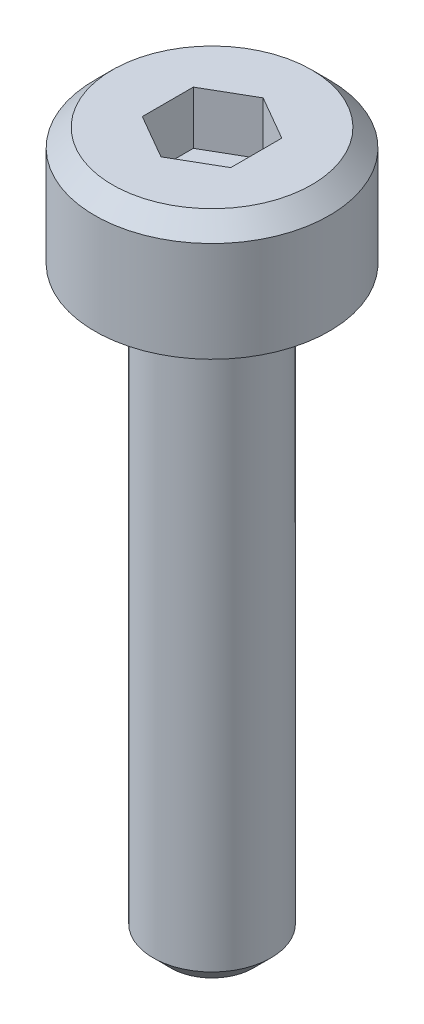
ISO-10303-21;
HEADER;
FILE_DESCRIPTION(('STEP AP214'),'2;1');
FILE_NAME('part.step','',(''),(''),'','','');
FILE_SCHEMA(('AUTOMOTIVE_DESIGN { 1 0 10303 214 1 1 1 1 }'));
ENDSEC;
DATA;
#1=APPLICATION_CONTEXT('core data for automotive mechanical design processes');
#2=APPLICATION_PROTOCOL_DEFINITION('international standard','automotive_design',2000,#1);
#3=PRODUCT_CONTEXT('',#1,'mechanical');
#4=PRODUCT('Part','Part','',(#3));
#5=PRODUCT_RELATED_PRODUCT_CATEGORY('part','',(#4));
#6=PRODUCT_DEFINITION_FORMATION('','',#4);
#7=PRODUCT_DEFINITION_CONTEXT('part definition',#1,'design');
#8=PRODUCT_DEFINITION('design','',#6,#7);
#9=PRODUCT_DEFINITION_SHAPE('','',#8);
#10=(LENGTH_UNIT() NAMED_UNIT(*) SI_UNIT(.MILLI.,.METRE.));
#11=(NAMED_UNIT(*) PLANE_ANGLE_UNIT() SI_UNIT($,.RADIAN.));
#12=(NAMED_UNIT(*) SI_UNIT($,.STERADIAN.) SOLID_ANGLE_UNIT());
#13=UNCERTAINTY_MEASURE_WITH_UNIT(LENGTH_MEASURE(1.E-05),#10,'distance_accuracy_value','');
#14=(GEOMETRIC_REPRESENTATION_CONTEXT(3) GLOBAL_UNCERTAINTY_ASSIGNED_CONTEXT((#13)) GLOBAL_UNIT_ASSIGNED_CONTEXT((#10,
#11,#12)) REPRESENTATION_CONTEXT('',''));
#15=CARTESIAN_POINT('',(0.,0.,0.));
#16=DIRECTION('',(0.,0.,1.));
#17=DIRECTION('',(1.,0.,0.));
#18=AXIS2_PLACEMENT_3D('',#15,#16,#17);
#19=CARTESIAN_POINT('',(0.,-10.,0.));
#20=DIRECTION('',(0.,-1.,0.));
#21=DIRECTION('',(0.,0.,-1.));
#22=AXIS2_PLACEMENT_3D('',#19,#20,#21);
#23=PLANE('',#22);
#24=CARTESIAN_POINT('',(0.,-10.,0.));
#25=DIRECTION('',(0.,-1.,0.));
#26=DIRECTION('',(0.,0.,-1.));
#27=AXIS2_PLACEMENT_3D('',#24,#25,#26);
#28=CIRCLE('',#27,0.7);
#29=CARTESIAN_POINT('',(0.,-10.,-0.7));
#30=VERTEX_POINT('',#29);
#31=EDGE_CURVE('E11',#30,#30,#28,.T.);
#32=ORIENTED_EDGE('',*,*,#31,.T.);
#33=EDGE_LOOP('',(#32));
#34=FACE_BOUND('',#33,.T.);
#35=ADVANCED_FACE('F41',(#34),#23,.T.);
#36=CARTESIAN_POINT('',(0.,-10.,0.));
#37=DIRECTION('',(0.,1.,0.));
#38=DIRECTION('',(0.,0.,1.));
#39=AXIS2_PLACEMENT_3D('',#36,#37,#38);
#40=CONICAL_SURFACE('',#39,0.7,0.785398163397448);
#41=CARTESIAN_POINT('',(0.,-9.7,0.));
#42=DIRECTION('',(0.,-1.,0.));
#43=DIRECTION('',(0.,0.,-1.));
#44=AXIS2_PLACEMENT_3D('',#41,#42,#43);
#45=CIRCLE('',#44,1.);
#46=CARTESIAN_POINT('',(0.,-9.7,-1.));
#47=VERTEX_POINT('',#46);
#48=EDGE_CURVE('E48',#47,#47,#45,.T.);
#49=ORIENTED_EDGE('',*,*,#48,.T.);
#50=EDGE_LOOP('',(#49));
#51=FACE_BOUND('',#50,.T.);
#52=ORIENTED_EDGE('',*,*,#31,.F.);
#53=EDGE_LOOP('',(#52));
#54=FACE_BOUND('',#53,.T.);
#55=ADVANCED_FACE('F161',(#51,#54),#40,.T.);
#56=CARTESIAN_POINT('',(0.,-10.,0.));
#57=DIRECTION('',(0.,-1.,0.));
#58=DIRECTION('',(0.,0.,-1.));
#59=AXIS2_PLACEMENT_3D('',#56,#57,#58);
#60=CYLINDRICAL_SURFACE('',#59,1.);
#61=CARTESIAN_POINT('',(0.,0.,0.));
#62=DIRECTION('',(0.,-1.,0.));
#63=DIRECTION('',(0.,0.,-1.));
#64=AXIS2_PLACEMENT_3D('',#61,#62,#63);
#65=CIRCLE('',#64,1.);
#66=CARTESIAN_POINT('',(0.,0.,-1.));
#67=VERTEX_POINT('',#66);
#68=EDGE_CURVE('E156',#67,#67,#65,.T.);
#69=ORIENTED_EDGE('',*,*,#68,.T.);
#70=EDGE_LOOP('',(#69));
#71=FACE_BOUND('',#70,.T.);
#72=ORIENTED_EDGE('',*,*,#48,.F.);
#73=EDGE_LOOP('',(#72));
#74=FACE_BOUND('',#73,.T.);
#75=ADVANCED_FACE('F164',(#71,#74),#60,.T.);
#76=CARTESIAN_POINT('',(1.,0.,0.));
#77=DIRECTION('',(0.,-1.,0.));
#78=DIRECTION('',(0.,0.,-1.));
#79=AXIS2_PLACEMENT_3D('',#76,#77,#78);
#80=PLANE('',#79);
#81=CARTESIAN_POINT('',(0.,0.,0.));
#82=DIRECTION('',(0.,-1.,0.));
#83=DIRECTION('',(0.,0.,-1.));
#84=AXIS2_PLACEMENT_3D('',#81,#82,#83);
#85=CIRCLE('',#84,1.99);
#86=CARTESIAN_POINT('',(0.,0.,-1.99));
#87=VERTEX_POINT('',#86);
#88=EDGE_CURVE('E153',#87,#87,#85,.T.);
#89=ORIENTED_EDGE('',*,*,#88,.T.);
#90=EDGE_LOOP('',(#89));
#91=FACE_BOUND('',#90,.T.);
#92=ORIENTED_EDGE('',*,*,#68,.F.);
#93=EDGE_LOOP('',(#92));
#94=FACE_BOUND('',#93,.T.);
#95=ADVANCED_FACE('F166',(#91,#94),#80,.T.);
#96=CARTESIAN_POINT('',(0.,-10.,0.));
#97=DIRECTION('',(0.,-1.,0.));
#98=DIRECTION('',(0.,0.,-1.));
#99=AXIS2_PLACEMENT_3D('',#96,#97,#98);
#100=CYLINDRICAL_SURFACE('',#99,1.99);
#101=CARTESIAN_POINT('',(0.,1.7,0.));
#102=DIRECTION('',(0.,-1.,0.));
#103=DIRECTION('',(0.,0.,-1.));
#104=AXIS2_PLACEMENT_3D('',#101,#102,#103);
#105=CIRCLE('',#104,1.99);
#106=CARTESIAN_POINT('',(0.,1.7,-1.99));
#107=VERTEX_POINT('',#106);
#108=EDGE_CURVE('E150',#107,#107,#105,.T.);
#109=ORIENTED_EDGE('',*,*,#108,.T.);
#110=EDGE_LOOP('',(#109));
#111=FACE_BOUND('',#110,.T.);
#112=ORIENTED_EDGE('',*,*,#88,.F.);
#113=EDGE_LOOP('',(#112));
#114=FACE_BOUND('',#113,.T.);
#115=ADVANCED_FACE('F172',(#111,#114),#100,.T.);
#116=CARTESIAN_POINT('',(0.,1.7,0.));
#117=DIRECTION('',(0.,-1.,0.));
#118=DIRECTION('',(0.,0.,-1.));
#119=AXIS2_PLACEMENT_3D('',#116,#117,#118);
#120=CONICAL_SURFACE('',#119,1.99,0.785398163397448);
#121=CARTESIAN_POINT('',(0.,2.,0.));
#122=DIRECTION('',(0.,-1.,0.));
#123=DIRECTION('',(0.,0.,-1.));
#124=AXIS2_PLACEMENT_3D('',#121,#122,#123);
#125=CIRCLE('',#124,1.69);
#126=CARTESIAN_POINT('',(0.,2.,-1.69));
#127=VERTEX_POINT('',#126);
#128=EDGE_CURVE('E142',#127,#127,#125,.T.);
#129=ORIENTED_EDGE('',*,*,#128,.T.);
#130=EDGE_LOOP('',(#129));
#131=FACE_BOUND('',#130,.T.);
#132=ORIENTED_EDGE('',*,*,#108,.F.);
#133=EDGE_LOOP('',(#132));
#134=FACE_BOUND('',#133,.T.);
#135=ADVANCED_FACE('F207',(#131,#134),#120,.T.);
#136=CARTESIAN_POINT('',(1.69,2.,0.));
#137=DIRECTION('',(0.,1.,0.));
#138=DIRECTION('',(0.,0.,1.));
#139=AXIS2_PLACEMENT_3D('',#136,#137,#138);
#140=PLANE('',#139);
#141=DIRECTION('',(0.,0.,-1.));
#142=VECTOR('',#141,1.);
#143=CARTESIAN_POINT('',(0.75,2.,-0.433012701892219));
#144=LINE('',#143,#142);
#145=CARTESIAN_POINT('',(0.75,2.,0.433012701892219));
#146=VERTEX_POINT('',#145);
#147=CARTESIAN_POINT('',(0.75,2.,-0.433012701892219));
#148=VERTEX_POINT('',#147);
#149=EDGE_CURVE('E55',#146,#148,#144,.T.);
#150=ORIENTED_EDGE('',*,*,#149,.F.);
#151=DIRECTION('',(0.866025403784439,0.,-0.5));
#152=VECTOR('',#151,1.);
#153=CARTESIAN_POINT('',(0.75,2.,0.433012701892219));
#154=LINE('',#153,#152);
#155=CARTESIAN_POINT('',(0.,2.,0.866025403784439));
#156=VERTEX_POINT('',#155);
#157=EDGE_CURVE('E138',#156,#146,#154,.T.);
#158=ORIENTED_EDGE('',*,*,#157,.F.);
#159=DIRECTION('',(0.866025403784439,0.,0.5));
#160=VECTOR('',#159,1.);
#161=CARTESIAN_POINT('',(0.,2.,0.866025403784439));
#162=LINE('',#161,#160);
#163=CARTESIAN_POINT('',(-0.75,2.,0.43301270189222));
#164=VERTEX_POINT('',#163);
#165=EDGE_CURVE('E136',#164,#156,#162,.T.);
#166=ORIENTED_EDGE('',*,*,#165,.F.);
#167=DIRECTION('',(0.,0.,1.));
#168=VECTOR('',#167,1.);
#169=CARTESIAN_POINT('',(-0.75,2.,0.43301270189222));
#170=LINE('',#169,#168);
#171=CARTESIAN_POINT('',(-0.75,2.,-0.433012701892219));
#172=VERTEX_POINT('',#171);
#173=EDGE_CURVE('E103',#172,#164,#170,.T.);
#174=ORIENTED_EDGE('',*,*,#173,.F.);
#175=DIRECTION('',(-0.866025403784438,0.,0.5));
#176=VECTOR('',#175,1.);
#177=CARTESIAN_POINT('',(-0.75,2.,-0.433012701892219));
#178=LINE('',#177,#176);
#179=CARTESIAN_POINT('',(0.,2.,-0.866025403784439));
#180=VERTEX_POINT('',#179);
#181=EDGE_CURVE('E132',#180,#172,#178,.T.);
#182=ORIENTED_EDGE('',*,*,#181,.F.);
#183=DIRECTION('',(-0.866025403784439,0.,-0.5));
#184=VECTOR('',#183,1.);
#185=CARTESIAN_POINT('',(0.,2.,-0.866025403784439));
#186=LINE('',#185,#184);
#187=EDGE_CURVE('E129',#148,#180,#186,.T.);
#188=ORIENTED_EDGE('',*,*,#187,.F.);
#189=EDGE_LOOP('',(#150,#158,#166,#174,#182,#188));
#190=FACE_BOUND('',#189,.T.);
#191=ORIENTED_EDGE('',*,*,#128,.F.);
#192=EDGE_LOOP('',(#191));
#193=FACE_BOUND('',#192,.T.);
#194=ADVANCED_FACE('F216',(#190,#193),#140,.T.);
#195=CARTESIAN_POINT('',(0.75,1.1,-0.433012701892219));
#196=DIRECTION('',(1.,0.,0.));
#197=DIRECTION('',(0.,0.,-1.));
#198=AXIS2_PLACEMENT_3D('',#195,#196,#197);
#199=PLANE('',#198);
#200=ORIENTED_EDGE('',*,*,#149,.T.);
#201=DIRECTION('',(0.,1.,0.));
#202=VECTOR('',#201,1.);
#203=CARTESIAN_POINT('',(0.75,1.1,-0.433012701892219));
#204=LINE('',#203,#202);
#205=CARTESIAN_POINT('',(0.75,1.1,-0.433012701892219));
#206=VERTEX_POINT('',#205);
#207=EDGE_CURVE('E85',#206,#148,#204,.T.);
#208=ORIENTED_EDGE('',*,*,#207,.F.);
#209=DIRECTION('',(0.,0.,-1.));
#210=VECTOR('',#209,1.);
#211=CARTESIAN_POINT('',(0.75,1.1,-0.433012701892219));
#212=LINE('',#211,#210);
#213=CARTESIAN_POINT('',(0.75,1.1,0.433012701892219));
#214=VERTEX_POINT('',#213);
#215=EDGE_CURVE('E140',#214,#206,#212,.T.);
#216=ORIENTED_EDGE('',*,*,#215,.F.);
#217=DIRECTION('',(0.,1.,0.));
#218=VECTOR('',#217,1.);
#219=CARTESIAN_POINT('',(0.75,1.1,0.433012701892219));
#220=LINE('',#219,#218);
#221=EDGE_CURVE('E63',#214,#146,#220,.T.);
#222=ORIENTED_EDGE('',*,*,#221,.T.);
#223=EDGE_LOOP('',(#200,#208,#216,#222));
#224=FACE_BOUND('',#223,.T.);
#225=ADVANCED_FACE('F225',(#224),#199,.F.);
#226=CARTESIAN_POINT('',(0.75,1.1,0.433012701892219));
#227=DIRECTION('',(0.5,0.,0.866025403784439));
#228=DIRECTION('',(0.866025403784439,0.,-0.5));
#229=AXIS2_PLACEMENT_3D('',#226,#227,#228);
#230=PLANE('',#229);
#231=ORIENTED_EDGE('',*,*,#157,.T.);
#232=ORIENTED_EDGE('',*,*,#221,.F.);
#233=DIRECTION('',(0.866025403784439,0.,-0.5));
#234=VECTOR('',#233,1.);
#235=CARTESIAN_POINT('',(0.75,1.1,0.433012701892219));
#236=LINE('',#235,#234);
#237=CARTESIAN_POINT('',(0.,1.1,0.866025403784439));
#238=VERTEX_POINT('',#237);
#239=EDGE_CURVE('E115',#238,#214,#236,.T.);
#240=ORIENTED_EDGE('',*,*,#239,.F.);
#241=DIRECTION('',(0.,1.,0.));
#242=VECTOR('',#241,1.);
#243=CARTESIAN_POINT('',(0.,1.1,0.866025403784439));
#244=LINE('',#243,#242);
#245=EDGE_CURVE('E107',#238,#156,#244,.T.);
#246=ORIENTED_EDGE('',*,*,#245,.T.);
#247=EDGE_LOOP('',(#231,#232,#240,#246));
#248=FACE_BOUND('',#247,.T.);
#249=ADVANCED_FACE('F234',(#248),#230,.F.);
#250=CARTESIAN_POINT('',(0.,1.1,0.866025403784439));
#251=DIRECTION('',(-0.5,0.,0.866025403784439));
#252=DIRECTION('',(0.866025403784439,0.,0.5));
#253=AXIS2_PLACEMENT_3D('',#250,#251,#252);
#254=PLANE('',#253);
#255=ORIENTED_EDGE('',*,*,#165,.T.);
#256=ORIENTED_EDGE('',*,*,#245,.F.);
#257=DIRECTION('',(0.866025403784439,0.,0.5));
#258=VECTOR('',#257,1.);
#259=CARTESIAN_POINT('',(0.,1.1,0.866025403784439));
#260=LINE('',#259,#258);
#261=CARTESIAN_POINT('',(-0.75,1.1,0.43301270189222));
#262=VERTEX_POINT('',#261);
#263=EDGE_CURVE('E111',#262,#238,#260,.T.);
#264=ORIENTED_EDGE('',*,*,#263,.F.);
#265=DIRECTION('',(0.,1.,0.));
#266=VECTOR('',#265,1.);
#267=CARTESIAN_POINT('',(-0.75,1.1,0.43301270189222));
#268=LINE('',#267,#266);
#269=EDGE_CURVE('E96',#262,#164,#268,.T.);
#270=ORIENTED_EDGE('',*,*,#269,.T.);
#271=EDGE_LOOP('',(#255,#256,#264,#270));
#272=FACE_BOUND('',#271,.T.);
#273=ADVANCED_FACE('F112',(#272),#254,.F.);
#274=CARTESIAN_POINT('',(-0.75,1.1,0.43301270189222));
#275=DIRECTION('',(-1.,0.,0.));
#276=DIRECTION('',(0.,0.,1.));
#277=AXIS2_PLACEMENT_3D('',#274,#275,#276);
#278=PLANE('',#277);
#279=ORIENTED_EDGE('',*,*,#173,.T.);
#280=ORIENTED_EDGE('',*,*,#269,.F.);
#281=DIRECTION('',(0.,0.,1.));
#282=VECTOR('',#281,1.);
#283=CARTESIAN_POINT('',(-0.75,1.1,0.43301270189222));
#284=LINE('',#283,#282);
#285=CARTESIAN_POINT('',(-0.75,1.1,-0.433012701892219));
#286=VERTEX_POINT('',#285);
#287=EDGE_CURVE('E100',#286,#262,#284,.T.);
#288=ORIENTED_EDGE('',*,*,#287,.F.);
#289=DIRECTION('',(0.,1.,0.));
#290=VECTOR('',#289,1.);
#291=CARTESIAN_POINT('',(-0.75,1.1,-0.433012701892219));
#292=LINE('',#291,#290);
#293=EDGE_CURVE('E108',#286,#172,#292,.T.);
#294=ORIENTED_EDGE('',*,*,#293,.T.);
#295=EDGE_LOOP('',(#279,#280,#288,#294));
#296=FACE_BOUND('',#295,.T.);
#297=ADVANCED_FACE('F98',(#296),#278,.F.);
#298=CARTESIAN_POINT('',(-0.75,1.1,-0.433012701892219));
#299=DIRECTION('',(-0.5,0.,-0.866025403784438));
#300=DIRECTION('',(-0.866025403784439,0.,0.5));
#301=AXIS2_PLACEMENT_3D('',#298,#299,#300);
#302=PLANE('',#301);
#303=ORIENTED_EDGE('',*,*,#181,.T.);
#304=ORIENTED_EDGE('',*,*,#293,.F.);
#305=DIRECTION('',(-0.866025403784438,0.,0.5));
#306=VECTOR('',#305,1.);
#307=CARTESIAN_POINT('',(-0.75,1.1,-0.433012701892219));
#308=LINE('',#307,#306);
#309=CARTESIAN_POINT('',(0.,1.1,-0.866025403784439));
#310=VERTEX_POINT('',#309);
#311=EDGE_CURVE('E121',#310,#286,#308,.T.);
#312=ORIENTED_EDGE('',*,*,#311,.F.);
#313=DIRECTION('',(0.,1.,0.));
#314=VECTOR('',#313,1.);
#315=CARTESIAN_POINT('',(0.,1.1,-0.866025403784439));
#316=LINE('',#315,#314);
#317=EDGE_CURVE('E145',#310,#180,#316,.T.);
#318=ORIENTED_EDGE('',*,*,#317,.T.);
#319=EDGE_LOOP('',(#303,#304,#312,#318));
#320=FACE_BOUND('',#319,.T.);
#321=ADVANCED_FACE('F256',(#320),#302,.F.);
#322=CARTESIAN_POINT('',(0.,1.1,-0.866025403784439));
#323=DIRECTION('',(0.5,0.,-0.866025403784439));
#324=DIRECTION('',(-0.866025403784439,0.,-0.5));
#325=AXIS2_PLACEMENT_3D('',#322,#323,#324);
#326=PLANE('',#325);
#327=ORIENTED_EDGE('',*,*,#187,.T.);
#328=ORIENTED_EDGE('',*,*,#317,.F.);
#329=DIRECTION('',(-0.866025403784439,0.,-0.5));
#330=VECTOR('',#329,1.);
#331=CARTESIAN_POINT('',(0.,1.1,-0.866025403784439));
#332=LINE('',#331,#330);
#333=EDGE_CURVE('E123',#206,#310,#332,.T.);
#334=ORIENTED_EDGE('',*,*,#333,.F.);
#335=ORIENTED_EDGE('',*,*,#207,.T.);
#336=EDGE_LOOP('',(#327,#328,#334,#335));
#337=FACE_BOUND('',#336,.T.);
#338=ADVANCED_FACE('F264',(#337),#326,.F.);
#339=CARTESIAN_POINT('',(0.,1.1,0.));
#340=DIRECTION('',(0.,-1.,0.));
#341=DIRECTION('',(0.,0.,-1.));
#342=AXIS2_PLACEMENT_3D('',#339,#340,#341);
#343=PLANE('',#342);
#344=ORIENTED_EDGE('',*,*,#215,.T.);
#345=ORIENTED_EDGE('',*,*,#333,.T.);
#346=ORIENTED_EDGE('',*,*,#311,.T.);
#347=ORIENTED_EDGE('',*,*,#287,.T.);
#348=ORIENTED_EDGE('',*,*,#263,.T.);
#349=ORIENTED_EDGE('',*,*,#239,.T.);
#350=EDGE_LOOP('',(#344,#345,#346,#347,#348,#349));
#351=FACE_BOUND('',#350,.T.);
#352=ADVANCED_FACE('F118',(#351),#343,.F.);
#353=CLOSED_SHELL('',(#35,#55,#75,#95,#115,#135,#194,#225,#249,#273,#297,#321,#338,#352));
#354=MANIFOLD_SOLID_BREP('B2',#353);
#355=ADVANCED_BREP_SHAPE_REPRESENTATION('',(#18,#354),#14);
#356=SHAPE_DEFINITION_REPRESENTATION(#9,#355);
ENDSEC;
END-ISO-10303-21;
